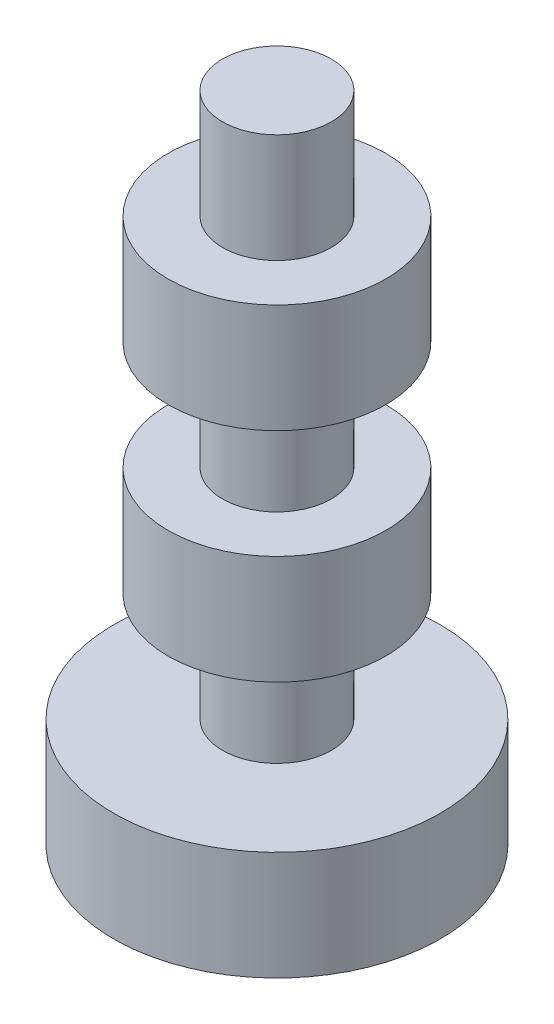
ISO-10303-21;
HEADER;
FILE_DESCRIPTION(('STEP AP214'),'2;1');
FILE_NAME('part.step','',(''),(''),'','','');
FILE_SCHEMA(('AUTOMOTIVE_DESIGN { 1 0 10303 214 1 1 1 1 }'));
ENDSEC;
DATA;
#1=APPLICATION_CONTEXT('core data for automotive mechanical design processes');
#2=APPLICATION_PROTOCOL_DEFINITION('international standard','automotive_design',2000,#1);
#3=PRODUCT_CONTEXT('',#1,'mechanical');
#4=PRODUCT('Part','Part','',(#3));
#5=PRODUCT_RELATED_PRODUCT_CATEGORY('part','',(#4));
#6=PRODUCT_DEFINITION_FORMATION('','',#4);
#7=PRODUCT_DEFINITION_CONTEXT('part definition',#1,'design');
#8=PRODUCT_DEFINITION('design','',#6,#7);
#9=PRODUCT_DEFINITION_SHAPE('','',#8);
#10=(LENGTH_UNIT() NAMED_UNIT(*) SI_UNIT(.MILLI.,.METRE.));
#11=(NAMED_UNIT(*) PLANE_ANGLE_UNIT() SI_UNIT($,.RADIAN.));
#12=(NAMED_UNIT(*) SI_UNIT($,.STERADIAN.) SOLID_ANGLE_UNIT());
#13=UNCERTAINTY_MEASURE_WITH_UNIT(LENGTH_MEASURE(1.E-05),#10,'distance_accuracy_value','');
#14=(GEOMETRIC_REPRESENTATION_CONTEXT(3) GLOBAL_UNCERTAINTY_ASSIGNED_CONTEXT((#13)) GLOBAL_UNIT_ASSIGNED_CONTEXT((#10,
#11,#12)) REPRESENTATION_CONTEXT('',''));
#15=CARTESIAN_POINT('',(0.,0.,0.));
#16=DIRECTION('',(0.,0.,1.));
#17=DIRECTION('',(1.,0.,0.));
#18=AXIS2_PLACEMENT_3D('',#15,#16,#17);
#19=CARTESIAN_POINT('',(0.,0.,0.));
#20=DIRECTION('',(0.,-1.,0.));
#21=DIRECTION('',(0.,0.,-1.));
#22=AXIS2_PLACEMENT_3D('',#19,#20,#21);
#23=PLANE('',#22);
#24=CARTESIAN_POINT('',(0.,0.,0.));
#25=DIRECTION('',(0.,-1.,0.));
#26=DIRECTION('',(0.,0.,-1.));
#27=AXIS2_PLACEMENT_3D('',#24,#25,#26);
#28=CIRCLE('',#27,9.525);
#29=CARTESIAN_POINT('',(0.,0.,-9.525));
#30=VERTEX_POINT('',#29);
#31=EDGE_CURVE('E10',#30,#30,#28,.T.);
#32=ORIENTED_EDGE('',*,*,#31,.T.);
#33=EDGE_LOOP('',(#32));
#34=FACE_BOUND('',#33,.T.);
#35=ADVANCED_FACE('F31',(#34),#23,.T.);
#36=CARTESIAN_POINT('',(0.,0.,0.));
#37=DIRECTION('',(0.,-1.,0.));
#38=DIRECTION('',(0.,0.,-1.));
#39=AXIS2_PLACEMENT_3D('',#36,#37,#38);
#40=CYLINDRICAL_SURFACE('',#39,9.525);
#41=CARTESIAN_POINT('',(0.,6.35,0.));
#42=DIRECTION('',(0.,-1.,0.));
#43=DIRECTION('',(0.,0.,-1.));
#44=AXIS2_PLACEMENT_3D('',#41,#42,#43);
#45=CIRCLE('',#44,9.525);
#46=CARTESIAN_POINT('',(0.,6.35,-9.525));
#47=VERTEX_POINT('',#46);
#48=EDGE_CURVE('E37',#47,#47,#45,.T.);
#49=ORIENTED_EDGE('',*,*,#48,.T.);
#50=EDGE_LOOP('',(#49));
#51=FACE_BOUND('',#50,.T.);
#52=ORIENTED_EDGE('',*,*,#31,.F.);
#53=EDGE_LOOP('',(#52));
#54=FACE_BOUND('',#53,.T.);
#55=ADVANCED_FACE('F87',(#51,#54),#40,.T.);
#56=CARTESIAN_POINT('',(9.525,6.35,0.));
#57=DIRECTION('',(0.,1.,0.));
#58=DIRECTION('',(0.,0.,1.));
#59=AXIS2_PLACEMENT_3D('',#56,#57,#58);
#60=PLANE('',#59);
#61=CARTESIAN_POINT('',(0.,6.35,0.));
#62=DIRECTION('',(0.,-1.,0.));
#63=DIRECTION('',(0.,0.,-1.));
#64=AXIS2_PLACEMENT_3D('',#61,#62,#63);
#65=CIRCLE('',#64,3.175);
#66=CARTESIAN_POINT('',(0.,6.35,-3.175));
#67=VERTEX_POINT('',#66);
#68=EDGE_CURVE('E41',#67,#67,#65,.T.);
#69=ORIENTED_EDGE('',*,*,#68,.T.);
#70=EDGE_LOOP('',(#69));
#71=FACE_BOUND('',#70,.T.);
#72=ORIENTED_EDGE('',*,*,#48,.F.);
#73=EDGE_LOOP('',(#72));
#74=FACE_BOUND('',#73,.T.);
#75=ADVANCED_FACE('F91',(#71,#74),#60,.T.);
#76=CARTESIAN_POINT('',(0.,0.,0.));
#77=DIRECTION('',(0.,-1.,0.));
#78=DIRECTION('',(0.,0.,-1.));
#79=AXIS2_PLACEMENT_3D('',#76,#77,#78);
#80=CYLINDRICAL_SURFACE('',#79,3.175);
#81=CARTESIAN_POINT('',(0.,12.7,0.));
#82=DIRECTION('',(0.,-1.,0.));
#83=DIRECTION('',(0.,0.,-1.));
#84=AXIS2_PLACEMENT_3D('',#81,#82,#83);
#85=CIRCLE('',#84,3.175);
#86=CARTESIAN_POINT('',(0.,12.7,-3.175));
#87=VERTEX_POINT('',#86);
#88=EDGE_CURVE('E45',#87,#87,#85,.T.);
#89=ORIENTED_EDGE('',*,*,#88,.T.);
#90=EDGE_LOOP('',(#89));
#91=FACE_BOUND('',#90,.T.);
#92=ORIENTED_EDGE('',*,*,#68,.F.);
#93=EDGE_LOOP('',(#92));
#94=FACE_BOUND('',#93,.T.);
#95=ADVANCED_FACE('F95',(#91,#94),#80,.T.);
#96=CARTESIAN_POINT('',(3.175,12.7,0.));
#97=DIRECTION('',(0.,-1.,0.));
#98=DIRECTION('',(0.,0.,-1.));
#99=AXIS2_PLACEMENT_3D('',#96,#97,#98);
#100=PLANE('',#99);
#101=CARTESIAN_POINT('',(0.,12.7,0.));
#102=DIRECTION('',(0.,-1.,0.));
#103=DIRECTION('',(0.,0.,-1.));
#104=AXIS2_PLACEMENT_3D('',#101,#102,#103);
#105=CIRCLE('',#104,6.35);
#106=CARTESIAN_POINT('',(0.,12.7,-6.35));
#107=VERTEX_POINT('',#106);
#108=EDGE_CURVE('E50',#107,#107,#105,.T.);
#109=ORIENTED_EDGE('',*,*,#108,.T.);
#110=EDGE_LOOP('',(#109));
#111=FACE_BOUND('',#110,.T.);
#112=ORIENTED_EDGE('',*,*,#88,.F.);
#113=EDGE_LOOP('',(#112));
#114=FACE_BOUND('',#113,.T.);
#115=ADVANCED_FACE('F102',(#111,#114),#100,.T.);
#116=CARTESIAN_POINT('',(0.,0.,0.));
#117=DIRECTION('',(0.,-1.,0.));
#118=DIRECTION('',(0.,0.,-1.));
#119=AXIS2_PLACEMENT_3D('',#116,#117,#118);
#120=CYLINDRICAL_SURFACE('',#119,6.35);
#121=CARTESIAN_POINT('',(0.,19.05,0.));
#122=DIRECTION('',(0.,-1.,0.));
#123=DIRECTION('',(0.,0.,-1.));
#124=AXIS2_PLACEMENT_3D('',#121,#122,#123);
#125=CIRCLE('',#124,6.35);
#126=CARTESIAN_POINT('',(0.,19.05,-6.35));
#127=VERTEX_POINT('',#126);
#128=EDGE_CURVE('E53',#127,#127,#125,.T.);
#129=ORIENTED_EDGE('',*,*,#128,.T.);
#130=EDGE_LOOP('',(#129));
#131=FACE_BOUND('',#130,.T.);
#132=ORIENTED_EDGE('',*,*,#108,.F.);
#133=EDGE_LOOP('',(#132));
#134=FACE_BOUND('',#133,.T.);
#135=ADVANCED_FACE('F106',(#131,#134),#120,.T.);
#136=CARTESIAN_POINT('',(6.35,19.05,0.));
#137=DIRECTION('',(0.,1.,0.));
#138=DIRECTION('',(0.,0.,1.));
#139=AXIS2_PLACEMENT_3D('',#136,#137,#138);
#140=PLANE('',#139);
#141=CARTESIAN_POINT('',(0.,19.05,0.));
#142=DIRECTION('',(0.,-1.,0.));
#143=DIRECTION('',(0.,0.,-1.));
#144=AXIS2_PLACEMENT_3D('',#141,#142,#143);
#145=CIRCLE('',#144,3.175);
#146=CARTESIAN_POINT('',(0.,19.05,-3.175));
#147=VERTEX_POINT('',#146);
#148=EDGE_CURVE('E56',#147,#147,#145,.T.);
#149=ORIENTED_EDGE('',*,*,#148,.T.);
#150=EDGE_LOOP('',(#149));
#151=FACE_BOUND('',#150,.T.);
#152=ORIENTED_EDGE('',*,*,#128,.F.);
#153=EDGE_LOOP('',(#152));
#154=FACE_BOUND('',#153,.T.);
#155=ADVANCED_FACE('F110',(#151,#154),#140,.T.);
#156=CARTESIAN_POINT('',(0.,0.,0.));
#157=DIRECTION('',(0.,-1.,0.));
#158=DIRECTION('',(0.,0.,-1.));
#159=AXIS2_PLACEMENT_3D('',#156,#157,#158);
#160=CYLINDRICAL_SURFACE('',#159,3.175);
#161=CARTESIAN_POINT('',(0.,25.4,0.));
#162=DIRECTION('',(0.,-1.,0.));
#163=DIRECTION('',(0.,0.,-1.));
#164=AXIS2_PLACEMENT_3D('',#161,#162,#163);
#165=CIRCLE('',#164,3.175);
#166=CARTESIAN_POINT('',(0.,25.4,-3.175));
#167=VERTEX_POINT('',#166);
#168=EDGE_CURVE('E59',#167,#167,#165,.T.);
#169=ORIENTED_EDGE('',*,*,#168,.T.);
#170=EDGE_LOOP('',(#169));
#171=FACE_BOUND('',#170,.T.);
#172=ORIENTED_EDGE('',*,*,#148,.F.);
#173=EDGE_LOOP('',(#172));
#174=FACE_BOUND('',#173,.T.);
#175=ADVANCED_FACE('F114',(#171,#174),#160,.T.);
#176=CARTESIAN_POINT('',(3.175,25.4,0.));
#177=DIRECTION('',(0.,-1.,0.));
#178=DIRECTION('',(0.,0.,-1.));
#179=AXIS2_PLACEMENT_3D('',#176,#177,#178);
#180=PLANE('',#179);
#181=CARTESIAN_POINT('',(0.,25.4,0.));
#182=DIRECTION('',(0.,-1.,0.));
#183=DIRECTION('',(0.,0.,-1.));
#184=AXIS2_PLACEMENT_3D('',#181,#182,#183);
#185=CIRCLE('',#184,6.35);
#186=CARTESIAN_POINT('',(0.,25.4,-6.35));
#187=VERTEX_POINT('',#186);
#188=EDGE_CURVE('E62',#187,#187,#185,.T.);
#189=ORIENTED_EDGE('',*,*,#188,.T.);
#190=EDGE_LOOP('',(#189));
#191=FACE_BOUND('',#190,.T.);
#192=ORIENTED_EDGE('',*,*,#168,.F.);
#193=EDGE_LOOP('',(#192));
#194=FACE_BOUND('',#193,.T.);
#195=ADVANCED_FACE('F118',(#191,#194),#180,.T.);
#196=CARTESIAN_POINT('',(0.,0.,0.));
#197=DIRECTION('',(0.,-1.,0.));
#198=DIRECTION('',(0.,0.,-1.));
#199=AXIS2_PLACEMENT_3D('',#196,#197,#198);
#200=CYLINDRICAL_SURFACE('',#199,6.35);
#201=CARTESIAN_POINT('',(0.,31.75,0.));
#202=DIRECTION('',(0.,-1.,0.));
#203=DIRECTION('',(0.,0.,-1.));
#204=AXIS2_PLACEMENT_3D('',#201,#202,#203);
#205=CIRCLE('',#204,6.35);
#206=CARTESIAN_POINT('',(0.,31.75,-6.35));
#207=VERTEX_POINT('',#206);
#208=EDGE_CURVE('E65',#207,#207,#205,.T.);
#209=ORIENTED_EDGE('',*,*,#208,.T.);
#210=EDGE_LOOP('',(#209));
#211=FACE_BOUND('',#210,.T.);
#212=ORIENTED_EDGE('',*,*,#188,.F.);
#213=EDGE_LOOP('',(#212));
#214=FACE_BOUND('',#213,.T.);
#215=ADVANCED_FACE('F122',(#211,#214),#200,.T.);
#216=CARTESIAN_POINT('',(6.35,31.75,0.));
#217=DIRECTION('',(0.,1.,0.));
#218=DIRECTION('',(0.,0.,1.));
#219=AXIS2_PLACEMENT_3D('',#216,#217,#218);
#220=PLANE('',#219);
#221=CARTESIAN_POINT('',(0.,31.75,0.));
#222=DIRECTION('',(0.,-1.,0.));
#223=DIRECTION('',(0.,0.,-1.));
#224=AXIS2_PLACEMENT_3D('',#221,#222,#223);
#225=CIRCLE('',#224,3.175);
#226=CARTESIAN_POINT('',(0.,31.75,-3.175));
#227=VERTEX_POINT('',#226);
#228=EDGE_CURVE('E68',#227,#227,#225,.T.);
#229=ORIENTED_EDGE('',*,*,#228,.T.);
#230=EDGE_LOOP('',(#229));
#231=FACE_BOUND('',#230,.T.);
#232=ORIENTED_EDGE('',*,*,#208,.F.);
#233=EDGE_LOOP('',(#232));
#234=FACE_BOUND('',#233,.T.);
#235=ADVANCED_FACE('F84',(#231,#234),#220,.T.);
#236=CARTESIAN_POINT('',(0.,0.,0.));
#237=DIRECTION('',(0.,-1.,0.));
#238=DIRECTION('',(0.,0.,-1.));
#239=AXIS2_PLACEMENT_3D('',#236,#237,#238);
#240=CYLINDRICAL_SURFACE('',#239,3.175);
#241=CARTESIAN_POINT('',(0.,38.1,0.));
#242=DIRECTION('',(0.,-1.,0.));
#243=DIRECTION('',(0.,0.,-1.));
#244=AXIS2_PLACEMENT_3D('',#241,#242,#243);
#245=CIRCLE('',#244,3.175);
#246=CARTESIAN_POINT('',(0.,38.1,-3.175));
#247=VERTEX_POINT('',#246);
#248=EDGE_CURVE('E71',#247,#247,#245,.T.);
#249=ORIENTED_EDGE('',*,*,#248,.T.);
#250=EDGE_LOOP('',(#249));
#251=FACE_BOUND('',#250,.T.);
#252=ORIENTED_EDGE('',*,*,#228,.F.);
#253=EDGE_LOOP('',(#252));
#254=FACE_BOUND('',#253,.T.);
#255=ADVANCED_FACE('F75',(#251,#254),#240,.T.);
#256=CARTESIAN_POINT('',(3.175,38.1,0.));
#257=DIRECTION('',(0.,1.,0.));
#258=DIRECTION('',(0.,0.,1.));
#259=AXIS2_PLACEMENT_3D('',#256,#257,#258);
#260=PLANE('',#259);
#261=ORIENTED_EDGE('',*,*,#248,.F.);
#262=EDGE_LOOP('',(#261));
#263=FACE_BOUND('',#262,.T.);
#264=ADVANCED_FACE('F78',(#263),#260,.T.);
#265=CLOSED_SHELL('',(#35,#55,#75,#95,#115,#135,#155,#175,#195,#215,#235,#255,#264));
#266=MANIFOLD_SOLID_BREP('B2',#265);
#267=ADVANCED_BREP_SHAPE_REPRESENTATION('',(#18,#266),#14);
#268=SHAPE_DEFINITION_REPRESENTATION(#9,#267);
ENDSEC;
END-ISO-10303-21;
